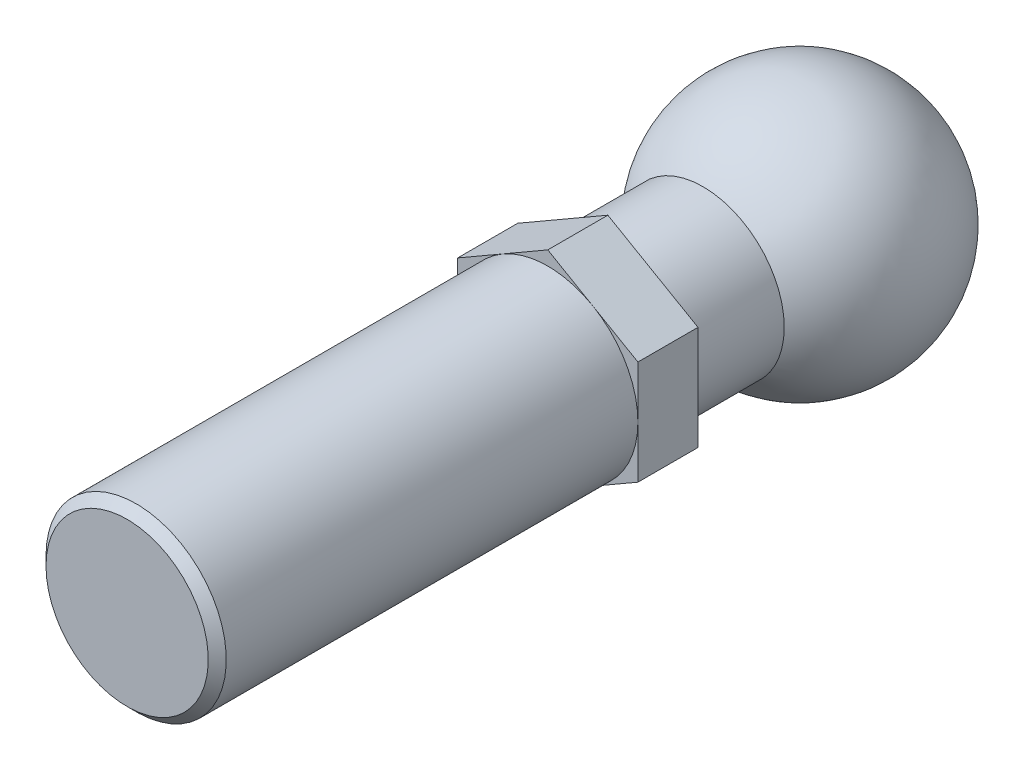
ISO-10303-21;
HEADER;
FILE_DESCRIPTION(('STEP AP214'),'2;1');
FILE_NAME('part.step','',(''),(''),'','','');
FILE_SCHEMA(('AUTOMOTIVE_DESIGN { 1 0 10303 214 1 1 1 1 }'));
ENDSEC;
DATA;
#1=APPLICATION_CONTEXT('core data for automotive mechanical design processes');
#2=APPLICATION_PROTOCOL_DEFINITION('international standard','automotive_design',2000,#1);
#3=PRODUCT_CONTEXT('',#1,'mechanical');
#4=PRODUCT('Part','Part','',(#3));
#5=PRODUCT_RELATED_PRODUCT_CATEGORY('part','',(#4));
#6=PRODUCT_DEFINITION_FORMATION('','',#4);
#7=PRODUCT_DEFINITION_CONTEXT('part definition',#1,'design');
#8=PRODUCT_DEFINITION('design','',#6,#7);
#9=PRODUCT_DEFINITION_SHAPE('','',#8);
#10=(LENGTH_UNIT() NAMED_UNIT(*) SI_UNIT(.MILLI.,.METRE.));
#11=(NAMED_UNIT(*) PLANE_ANGLE_UNIT() SI_UNIT($,.RADIAN.));
#12=(NAMED_UNIT(*) SI_UNIT($,.STERADIAN.) SOLID_ANGLE_UNIT());
#13=UNCERTAINTY_MEASURE_WITH_UNIT(LENGTH_MEASURE(1.E-05),#10,'distance_accuracy_value','');
#14=(GEOMETRIC_REPRESENTATION_CONTEXT(3) GLOBAL_UNCERTAINTY_ASSIGNED_CONTEXT((#13)) GLOBAL_UNIT_ASSIGNED_CONTEXT((#10,
#11,#12)) REPRESENTATION_CONTEXT('',''));
#15=CARTESIAN_POINT('',(0.,0.,0.));
#16=DIRECTION('',(0.,0.,1.));
#17=DIRECTION('',(1.,0.,0.));
#18=AXIS2_PLACEMENT_3D('',#15,#16,#17);
#19=CARTESIAN_POINT('',(0.,0.,0.));
#20=DIRECTION('',(0.,-1.,0.));
#21=DIRECTION('',(0.,0.,1.));
#22=AXIS2_PLACEMENT_3D('',#19,#20,#21);
#23=SPHERICAL_SURFACE('',#22,4.2);
#24=CARTESIAN_POINT('',(0.,4.2,0.));
#25=VERTEX_POINT('',#24);
#26=VERTEX_LOOP('',#25);
#27=FACE_BOUND('',#26,.T.);
#28=CARTESIAN_POINT('',(0.,0.,3.21714158842908));
#29=DIRECTION('',(0.,0.,-1.));
#30=DIRECTION('',(-1.,0.,0.));
#31=AXIS2_PLACEMENT_3D('',#28,#29,#30);
#32=CIRCLE('',#31,2.7);
#33=CARTESIAN_POINT('',(-2.7,0.,3.21714158842908));
#34=VERTEX_POINT('',#33);
#35=EDGE_CURVE('E20',#34,#34,#32,.F.);
#36=ORIENTED_EDGE('',*,*,#35,.F.);
#37=EDGE_LOOP('',(#36));
#38=FACE_BOUND('',#37,.T.);
#39=CARTESIAN_POINT('',(0.,-4.2,0.));
#40=VERTEX_POINT('',#39);
#41=VERTEX_LOOP('',#40);
#42=FACE_BOUND('',#41,.T.);
#43=ADVANCED_FACE('F16',(#27,#38,#42),#23,.T.);
#44=CARTESIAN_POINT('',(3.,-1.73205080756888,6.3875));
#45=DIRECTION('',(1.,0.,0.));
#46=DIRECTION('',(0.,1.,0.));
#47=AXIS2_PLACEMENT_3D('',#44,#45,#46);
#48=PLANE('',#47);
#49=DIRECTION('',(0.,0.,1.));
#50=VECTOR('',#49,1.);
#51=CARTESIAN_POINT('',(3.,1.73205080756888,6.3875));
#52=LINE('',#51,#50);
#53=CARTESIAN_POINT('',(3.,1.73205080756888,8.3875));
#54=VERTEX_POINT('',#53);
#55=CARTESIAN_POINT('',(3.,1.73205080756888,6.3875));
#56=VERTEX_POINT('',#55);
#57=EDGE_CURVE('E154',#54,#56,#52,.F.);
#58=ORIENTED_EDGE('',*,*,#57,.F.);
#59=DIRECTION('',(0.,1.,0.));
#60=VECTOR('',#59,1.);
#61=CARTESIAN_POINT('',(3.,-1.73205080756888,8.3875));
#62=LINE('',#61,#60);
#63=CARTESIAN_POINT('',(3.,0.,8.3875));
#64=VERTEX_POINT('',#63);
#65=EDGE_CURVE('E95',#54,#64,#62,.F.);
#66=ORIENTED_EDGE('',*,*,#65,.T.);
#67=DIRECTION('',(0.,1.,0.));
#68=VECTOR('',#67,1.);
#69=CARTESIAN_POINT('',(3.,-1.73205080756888,8.3875));
#70=LINE('',#69,#68);
#71=CARTESIAN_POINT('',(3.,-1.73205080756888,8.3875));
#72=VERTEX_POINT('',#71);
#73=EDGE_CURVE('E92',#64,#72,#70,.F.);
#74=ORIENTED_EDGE('',*,*,#73,.T.);
#75=DIRECTION('',(0.,0.,1.));
#76=VECTOR('',#75,1.);
#77=CARTESIAN_POINT('',(3.,-1.73205080756888,6.3875));
#78=LINE('',#77,#76);
#79=CARTESIAN_POINT('',(3.,-1.73205080756888,6.3875));
#80=VERTEX_POINT('',#79);
#81=EDGE_CURVE('E79',#80,#72,#78,.T.);
#82=ORIENTED_EDGE('',*,*,#81,.F.);
#83=DIRECTION('',(0.,1.,0.));
#84=VECTOR('',#83,1.);
#85=CARTESIAN_POINT('',(3.,1.73205080756888,6.3875));
#86=LINE('',#85,#84);
#87=EDGE_CURVE('E133',#56,#80,#86,.F.);
#88=ORIENTED_EDGE('',*,*,#87,.F.);
#89=EDGE_LOOP('',(#58,#66,#74,#82,#88));
#90=FACE_BOUND('',#89,.T.);
#91=ADVANCED_FACE('F69',(#90),#48,.T.);
#92=CARTESIAN_POINT('',(0.,-3.46410161513776,6.3875));
#93=DIRECTION('',(0.5,-0.866025403784439,0.));
#94=DIRECTION('',(0.866025403784439,0.5,0.));
#95=AXIS2_PLACEMENT_3D('',#92,#93,#94);
#96=PLANE('',#95);
#97=ORIENTED_EDGE('',*,*,#81,.T.);
#98=DIRECTION('',(0.866025403784439,0.5,0.));
#99=VECTOR('',#98,1.);
#100=CARTESIAN_POINT('',(0.,-3.46410161513776,8.3875));
#101=LINE('',#100,#99);
#102=CARTESIAN_POINT('',(1.5,-2.59807621135332,8.3875));
#103=VERTEX_POINT('',#102);
#104=EDGE_CURVE('E74',#72,#103,#101,.F.);
#105=ORIENTED_EDGE('',*,*,#104,.T.);
#106=DIRECTION('',(0.866025403784439,0.5,0.));
#107=VECTOR('',#106,1.);
#108=CARTESIAN_POINT('',(0.,-3.46410161513776,8.3875));
#109=LINE('',#108,#107);
#110=CARTESIAN_POINT('',(0.,-3.46410161513776,8.3875));
#111=VERTEX_POINT('',#110);
#112=EDGE_CURVE('E85',#103,#111,#109,.F.);
#113=ORIENTED_EDGE('',*,*,#112,.T.);
#114=DIRECTION('',(0.,0.,1.));
#115=VECTOR('',#114,1.);
#116=CARTESIAN_POINT('',(0.,-3.46410161513776,6.3875));
#117=LINE('',#116,#115);
#118=CARTESIAN_POINT('',(0.,-3.46410161513776,6.3875));
#119=VERTEX_POINT('',#118);
#120=EDGE_CURVE('E76',#119,#111,#117,.T.);
#121=ORIENTED_EDGE('',*,*,#120,.F.);
#122=DIRECTION('',(-0.866025403784439,-0.5,0.));
#123=VECTOR('',#122,1.);
#124=CARTESIAN_POINT('',(3.,-1.73205080756888,6.3875));
#125=LINE('',#124,#123);
#126=EDGE_CURVE('E126',#80,#119,#125,.T.);
#127=ORIENTED_EDGE('',*,*,#126,.F.);
#128=EDGE_LOOP('',(#97,#105,#113,#121,#127));
#129=FACE_BOUND('',#128,.T.);
#130=ADVANCED_FACE('F176',(#129),#96,.T.);
#131=CARTESIAN_POINT('',(0.,0.,8.3875));
#132=DIRECTION('',(0.,0.,-1.));
#133=DIRECTION('',(-1.,0.,0.));
#134=AXIS2_PLACEMENT_3D('',#131,#132,#133);
#135=CYLINDRICAL_SURFACE('',#134,2.7);
#136=CARTESIAN_POINT('',(0.,0.,6.3875));
#137=DIRECTION('',(0.,0.,-1.));
#138=DIRECTION('',(-1.,0.,0.));
#139=AXIS2_PLACEMENT_3D('',#136,#137,#138);
#140=CIRCLE('',#139,2.7);
#141=CARTESIAN_POINT('',(-2.7,0.,6.3875));
#142=VERTEX_POINT('',#141);
#143=EDGE_CURVE('E117',#142,#142,#140,.F.);
#144=ORIENTED_EDGE('',*,*,#143,.F.);
#145=EDGE_LOOP('',(#144));
#146=FACE_BOUND('',#145,.T.);
#147=ORIENTED_EDGE('',*,*,#35,.T.);
#148=EDGE_LOOP('',(#147));
#149=FACE_BOUND('',#148,.T.);
#150=ADVANCED_FACE('F396',(#146,#149),#135,.T.);
#151=CARTESIAN_POINT('',(-3.,-1.73205080756888,6.3875));
#152=DIRECTION('',(-0.5,-0.866025403784439,0.));
#153=DIRECTION('',(0.866025403784439,-0.5,0.));
#154=AXIS2_PLACEMENT_3D('',#151,#152,#153);
#155=PLANE('',#154);
#156=ORIENTED_EDGE('',*,*,#120,.T.);
#157=DIRECTION('',(0.866025403784439,-0.5,0.));
#158=VECTOR('',#157,1.);
#159=CARTESIAN_POINT('',(-3.,-1.73205080756888,8.3875));
#160=LINE('',#159,#158);
#161=CARTESIAN_POINT('',(-1.5,-2.59807621135332,8.3875));
#162=VERTEX_POINT('',#161);
#163=EDGE_CURVE('E142',#111,#162,#160,.F.);
#164=ORIENTED_EDGE('',*,*,#163,.T.);
#165=DIRECTION('',(0.866025403784439,-0.5,0.));
#166=VECTOR('',#165,1.);
#167=CARTESIAN_POINT('',(-3.,-1.73205080756888,8.3875));
#168=LINE('',#167,#166);
#169=CARTESIAN_POINT('',(-3.,-1.73205080756888,8.3875));
#170=VERTEX_POINT('',#169);
#171=EDGE_CURVE('E73',#162,#170,#168,.F.);
#172=ORIENTED_EDGE('',*,*,#171,.T.);
#173=DIRECTION('',(0.,0.,1.));
#174=VECTOR('',#173,1.);
#175=CARTESIAN_POINT('',(-3.,-1.73205080756888,6.3875));
#176=LINE('',#175,#174);
#177=CARTESIAN_POINT('',(-3.,-1.73205080756888,6.3875));
#178=VERTEX_POINT('',#177);
#179=EDGE_CURVE('E185',#178,#170,#176,.T.);
#180=ORIENTED_EDGE('',*,*,#179,.F.);
#181=DIRECTION('',(-0.866025403784439,0.5,0.));
#182=VECTOR('',#181,1.);
#183=CARTESIAN_POINT('',(0.,-3.46410161513775,6.3875));
#184=LINE('',#183,#182);
#185=EDGE_CURVE('E120',#119,#178,#184,.T.);
#186=ORIENTED_EDGE('',*,*,#185,.F.);
#187=EDGE_LOOP('',(#156,#164,#172,#180,#186));
#188=FACE_BOUND('',#187,.T.);
#189=ADVANCED_FACE('F183',(#188),#155,.T.);
#190=CARTESIAN_POINT('',(3.,1.73205080756888,6.3875));
#191=DIRECTION('',(0.5,0.866025403784439,0.));
#192=DIRECTION('',(-0.866025403784439,0.5,0.));
#193=AXIS2_PLACEMENT_3D('',#190,#191,#192);
#194=PLANE('',#193);
#195=DIRECTION('',(0.,0.,1.));
#196=VECTOR('',#195,1.);
#197=CARTESIAN_POINT('',(0.,3.46410161513775,6.3875));
#198=LINE('',#197,#196);
#199=CARTESIAN_POINT('',(0.,3.46410161513776,8.3875));
#200=VERTEX_POINT('',#199);
#201=CARTESIAN_POINT('',(0.,3.46410161513776,6.3875));
#202=VERTEX_POINT('',#201);
#203=EDGE_CURVE('E211',#200,#202,#198,.F.);
#204=ORIENTED_EDGE('',*,*,#203,.F.);
#205=DIRECTION('',(-0.866025403784439,0.5,0.));
#206=VECTOR('',#205,1.);
#207=CARTESIAN_POINT('',(3.,1.73205080756888,8.3875));
#208=LINE('',#207,#206);
#209=CARTESIAN_POINT('',(1.5,2.59807621135332,8.3875));
#210=VERTEX_POINT('',#209);
#211=EDGE_CURVE('E157',#200,#210,#208,.F.);
#212=ORIENTED_EDGE('',*,*,#211,.T.);
#213=DIRECTION('',(-0.866025403784439,0.5,0.));
#214=VECTOR('',#213,1.);
#215=CARTESIAN_POINT('',(3.,1.73205080756888,8.3875));
#216=LINE('',#215,#214);
#217=EDGE_CURVE('E158',#210,#54,#216,.F.);
#218=ORIENTED_EDGE('',*,*,#217,.T.);
#219=ORIENTED_EDGE('',*,*,#57,.T.);
#220=DIRECTION('',(0.866025403784439,-0.5,0.));
#221=VECTOR('',#220,1.);
#222=CARTESIAN_POINT('',(0.,3.46410161513775,6.3875));
#223=LINE('',#222,#221);
#224=EDGE_CURVE('E151',#202,#56,#223,.T.);
#225=ORIENTED_EDGE('',*,*,#224,.F.);
#226=EDGE_LOOP('',(#204,#212,#218,#219,#225));
#227=FACE_BOUND('',#226,.T.);
#228=ADVANCED_FACE('F208',(#227),#194,.T.);
#229=CARTESIAN_POINT('',(3.,1.73205080756888,6.3875));
#230=DIRECTION('',(0.,0.,-1.));
#231=DIRECTION('',(-1.,0.,0.));
#232=AXIS2_PLACEMENT_3D('',#229,#230,#231);
#233=PLANE('',#232);
#234=ORIENTED_EDGE('',*,*,#143,.T.);
#235=EDGE_LOOP('',(#234));
#236=FACE_BOUND('',#235,.T.);
#237=DIRECTION('',(0.,-1.,0.));
#238=VECTOR('',#237,1.);
#239=CARTESIAN_POINT('',(-3.,1.73205080756888,6.3875));
#240=LINE('',#239,#238);
#241=CARTESIAN_POINT('',(-3.,1.73205080756888,6.3875));
#242=VERTEX_POINT('',#241);
#243=EDGE_CURVE('E123',#242,#178,#240,.T.);
#244=ORIENTED_EDGE('',*,*,#243,.F.);
#245=DIRECTION('',(-0.866025403784439,-0.5,0.));
#246=VECTOR('',#245,1.);
#247=CARTESIAN_POINT('',(0.,3.46410161513775,6.3875));
#248=LINE('',#247,#246);
#249=EDGE_CURVE('E236',#202,#242,#248,.T.);
#250=ORIENTED_EDGE('',*,*,#249,.F.);
#251=ORIENTED_EDGE('',*,*,#224,.T.);
#252=ORIENTED_EDGE('',*,*,#87,.T.);
#253=ORIENTED_EDGE('',*,*,#126,.T.);
#254=ORIENTED_EDGE('',*,*,#185,.T.);
#255=EDGE_LOOP('',(#244,#250,#251,#252,#253,#254));
#256=FACE_BOUND('',#255,.T.);
#257=ADVANCED_FACE('F189',(#236,#256),#233,.T.);
#258=CARTESIAN_POINT('',(-3.,1.73205080756888,6.3875));
#259=DIRECTION('',(-1.,0.,0.));
#260=DIRECTION('',(0.,-1.,0.));
#261=AXIS2_PLACEMENT_3D('',#258,#259,#260);
#262=PLANE('',#261);
#263=ORIENTED_EDGE('',*,*,#179,.T.);
#264=DIRECTION('',(0.,-1.,0.));
#265=VECTOR('',#264,1.);
#266=CARTESIAN_POINT('',(-3.,1.73205080756888,8.3875));
#267=LINE('',#266,#265);
#268=CARTESIAN_POINT('',(-3.,0.,8.3875));
#269=VERTEX_POINT('',#268);
#270=EDGE_CURVE('E221',#170,#269,#267,.F.);
#271=ORIENTED_EDGE('',*,*,#270,.T.);
#272=DIRECTION('',(0.,-1.,0.));
#273=VECTOR('',#272,1.);
#274=CARTESIAN_POINT('',(-3.,1.73205080756888,8.3875));
#275=LINE('',#274,#273);
#276=CARTESIAN_POINT('',(-3.,1.73205080756888,8.3875));
#277=VERTEX_POINT('',#276);
#278=EDGE_CURVE('E119',#269,#277,#275,.F.);
#279=ORIENTED_EDGE('',*,*,#278,.T.);
#280=DIRECTION('',(0.,0.,1.));
#281=VECTOR('',#280,1.);
#282=CARTESIAN_POINT('',(-3.,1.73205080756888,6.3875));
#283=LINE('',#282,#281);
#284=EDGE_CURVE('E116',#242,#277,#283,.T.);
#285=ORIENTED_EDGE('',*,*,#284,.F.);
#286=ORIENTED_EDGE('',*,*,#243,.T.);
#287=EDGE_LOOP('',(#263,#271,#279,#285,#286));
#288=FACE_BOUND('',#287,.T.);
#289=ADVANCED_FACE('F273',(#288),#262,.T.);
#290=CARTESIAN_POINT('',(0.,2.69999999999999,22.3875));
#291=DIRECTION('',(0.,0.,1.));
#292=DIRECTION('',(1.,0.,0.));
#293=AXIS2_PLACEMENT_3D('',#290,#291,#292);
#294=PLANE('',#293);
#295=CARTESIAN_POINT('',(0.,0.,22.3875000000362));
#296=DIRECTION('',(0.,0.,-1.));
#297=DIRECTION('',(-1.,0.,0.));
#298=AXIS2_PLACEMENT_3D('',#295,#296,#297);
#299=CIRCLE('',#298,2.70000000000437);
#300=CARTESIAN_POINT('',(-2.70000000000437,0.,22.3875000000362));
#301=VERTEX_POINT('',#300);
#302=EDGE_CURVE('E113',#301,#301,#299,.T.);
#303=ORIENTED_EDGE('',*,*,#302,.F.);
#304=EDGE_LOOP('',(#303));
#305=FACE_BOUND('',#304,.T.);
#306=ADVANCED_FACE('F275',(#305),#294,.T.);
#307=CARTESIAN_POINT('',(0.,3.46410161513775,6.3875));
#308=DIRECTION('',(-0.5,0.866025403784439,0.));
#309=DIRECTION('',(-0.866025403784439,-0.5,0.));
#310=AXIS2_PLACEMENT_3D('',#307,#308,#309);
#311=PLANE('',#310);
#312=ORIENTED_EDGE('',*,*,#284,.T.);
#313=DIRECTION('',(-0.866025403784439,-0.499999999999999,0.));
#314=VECTOR('',#313,1.);
#315=CARTESIAN_POINT('',(-1.5,2.59807621135332,8.3875));
#316=LINE('',#315,#314);
#317=CARTESIAN_POINT('',(-1.5,2.59807621135332,8.3875));
#318=VERTEX_POINT('',#317);
#319=EDGE_CURVE('E35',#318,#277,#316,.T.);
#320=ORIENTED_EDGE('',*,*,#319,.F.);
#321=DIRECTION('',(-0.866025403784438,-0.500000000000001,0.));
#322=VECTOR('',#321,1.);
#323=CARTESIAN_POINT('',(0.,3.46410161513775,8.3875));
#324=LINE('',#323,#322);
#325=EDGE_CURVE('E115',#200,#318,#324,.T.);
#326=ORIENTED_EDGE('',*,*,#325,.F.);
#327=ORIENTED_EDGE('',*,*,#203,.T.);
#328=ORIENTED_EDGE('',*,*,#249,.T.);
#329=EDGE_LOOP('',(#312,#320,#326,#327,#328));
#330=FACE_BOUND('',#329,.T.);
#331=ADVANCED_FACE('F265',(#330),#311,.T.);
#332=CARTESIAN_POINT('',(0.,0.,8.3875));
#333=DIRECTION('',(0.,0.,1.));
#334=DIRECTION('',(1.,0.,0.));
#335=AXIS2_PLACEMENT_3D('',#332,#333,#334);
#336=PLANE('',#335);
#337=CARTESIAN_POINT('',(0.,0.,8.3875));
#338=DIRECTION('',(0.,0.,-1.));
#339=DIRECTION('',(-1.,0.,0.));
#340=AXIS2_PLACEMENT_3D('',#337,#338,#339);
#341=CIRCLE('',#340,3.);
#342=EDGE_CURVE('E110',#269,#162,#341,.F.);
#343=ORIENTED_EDGE('',*,*,#342,.F.);
#344=ORIENTED_EDGE('',*,*,#270,.F.);
#345=ORIENTED_EDGE('',*,*,#171,.F.);
#346=EDGE_LOOP('',(#343,#344,#345));
#347=FACE_BOUND('',#346,.T.);
#348=ADVANCED_FACE('F272',(#347),#336,.T.);
#349=CARTESIAN_POINT('',(0.,0.,8.3875));
#350=DIRECTION('',(0.,0.,1.));
#351=DIRECTION('',(1.,0.,0.));
#352=AXIS2_PLACEMENT_3D('',#349,#350,#351);
#353=PLANE('',#352);
#354=CARTESIAN_POINT('',(0.,0.,8.3875));
#355=DIRECTION('',(0.,0.,-1.));
#356=DIRECTION('',(-1.,0.,0.));
#357=AXIS2_PLACEMENT_3D('',#354,#355,#356);
#358=CIRCLE('',#357,3.);
#359=EDGE_CURVE('E107',#162,#103,#358,.F.);
#360=ORIENTED_EDGE('',*,*,#359,.F.);
#361=ORIENTED_EDGE('',*,*,#163,.F.);
#362=ORIENTED_EDGE('',*,*,#112,.F.);
#363=EDGE_LOOP('',(#360,#361,#362));
#364=FACE_BOUND('',#363,.T.);
#365=ADVANCED_FACE('F181',(#364),#353,.T.);
#366=CARTESIAN_POINT('',(0.,0.,8.3875));
#367=DIRECTION('',(0.,0.,1.));
#368=DIRECTION('',(1.,0.,0.));
#369=AXIS2_PLACEMENT_3D('',#366,#367,#368);
#370=PLANE('',#369);
#371=CARTESIAN_POINT('',(0.,0.,8.3875));
#372=DIRECTION('',(0.,0.,-1.));
#373=DIRECTION('',(-1.,0.,0.));
#374=AXIS2_PLACEMENT_3D('',#371,#372,#373);
#375=CIRCLE('',#374,3.);
#376=EDGE_CURVE('E104',#103,#64,#375,.F.);
#377=ORIENTED_EDGE('',*,*,#376,.F.);
#378=ORIENTED_EDGE('',*,*,#104,.F.);
#379=ORIENTED_EDGE('',*,*,#73,.F.);
#380=EDGE_LOOP('',(#377,#378,#379));
#381=FACE_BOUND('',#380,.T.);
#382=ADVANCED_FACE('F299',(#381),#370,.T.);
#383=CARTESIAN_POINT('',(0.,0.,22.0875000000547));
#384=DIRECTION('',(0.,0.,-1.));
#385=DIRECTION('',(-1.,0.,0.));
#386=AXIS2_PLACEMENT_3D('',#383,#384,#385);
#387=CONICAL_SURFACE('',#386,2.9999999999859,0.785398163397448);
#388=CARTESIAN_POINT('',(0.,0.,22.0875));
#389=DIRECTION('',(0.,0.,-1.));
#390=DIRECTION('',(-1.,0.,0.));
#391=AXIS2_PLACEMENT_3D('',#388,#389,#390);
#392=CIRCLE('',#391,3.);
#393=CARTESIAN_POINT('',(-3.,0.,22.0875));
#394=VERTEX_POINT('',#393);
#395=EDGE_CURVE('E103',#394,#394,#392,.T.);
#396=ORIENTED_EDGE('',*,*,#395,.F.);
#397=EDGE_LOOP('',(#396));
#398=FACE_BOUND('',#397,.T.);
#399=ORIENTED_EDGE('',*,*,#302,.T.);
#400=EDGE_LOOP('',(#399));
#401=FACE_BOUND('',#400,.T.);
#402=ADVANCED_FACE('F296',(#398,#401),#387,.T.);
#403=CARTESIAN_POINT('',(0.,0.,8.3875));
#404=DIRECTION('',(0.,0.,1.));
#405=DIRECTION('',(1.,0.,0.));
#406=AXIS2_PLACEMENT_3D('',#403,#404,#405);
#407=PLANE('',#406);
#408=CARTESIAN_POINT('',(0.,0.,8.3875));
#409=DIRECTION('',(0.,0.,-1.));
#410=DIRECTION('',(-1.,0.,0.));
#411=AXIS2_PLACEMENT_3D('',#408,#409,#410);
#412=CIRCLE('',#411,3.);
#413=EDGE_CURVE('E100',#64,#210,#412,.F.);
#414=ORIENTED_EDGE('',*,*,#413,.F.);
#415=ORIENTED_EDGE('',*,*,#65,.F.);
#416=ORIENTED_EDGE('',*,*,#217,.F.);
#417=EDGE_LOOP('',(#414,#415,#416));
#418=FACE_BOUND('',#417,.T.);
#419=ADVANCED_FACE('F203',(#418),#407,.T.);
#420=CARTESIAN_POINT('',(0.,0.,8.3875));
#421=DIRECTION('',(0.,0.,1.));
#422=DIRECTION('',(1.,0.,0.));
#423=AXIS2_PLACEMENT_3D('',#420,#421,#422);
#424=PLANE('',#423);
#425=CARTESIAN_POINT('',(0.,0.,8.3875));
#426=DIRECTION('',(0.,0.,-1.));
#427=DIRECTION('',(-1.,0.,0.));
#428=AXIS2_PLACEMENT_3D('',#425,#426,#427);
#429=CIRCLE('',#428,3.);
#430=EDGE_CURVE('E26',#210,#318,#429,.F.);
#431=ORIENTED_EDGE('',*,*,#430,.F.);
#432=ORIENTED_EDGE('',*,*,#211,.F.);
#433=ORIENTED_EDGE('',*,*,#325,.T.);
#434=EDGE_LOOP('',(#431,#432,#433));
#435=FACE_BOUND('',#434,.T.);
#436=ADVANCED_FACE('F264',(#435),#424,.T.);
#437=CARTESIAN_POINT('',(0.,0.,8.3875));
#438=DIRECTION('',(0.,0.,1.));
#439=DIRECTION('',(1.,0.,0.));
#440=AXIS2_PLACEMENT_3D('',#437,#438,#439);
#441=PLANE('',#440);
#442=CARTESIAN_POINT('',(0.,0.,8.3875));
#443=DIRECTION('',(0.,0.,-1.));
#444=DIRECTION('',(-1.,0.,0.));
#445=AXIS2_PLACEMENT_3D('',#442,#443,#444);
#446=CIRCLE('',#445,3.);
#447=EDGE_CURVE('E11',#318,#269,#446,.F.);
#448=ORIENTED_EDGE('',*,*,#447,.F.);
#449=ORIENTED_EDGE('',*,*,#319,.T.);
#450=ORIENTED_EDGE('',*,*,#278,.F.);
#451=EDGE_LOOP('',(#448,#449,#450));
#452=FACE_BOUND('',#451,.T.);
#453=ADVANCED_FACE('F259',(#452),#441,.T.);
#454=CARTESIAN_POINT('',(0.,0.,0.));
#455=DIRECTION('',(0.,0.,-1.));
#456=DIRECTION('',(-1.,0.,0.));
#457=AXIS2_PLACEMENT_3D('',#454,#455,#456);
#458=CYLINDRICAL_SURFACE('',#457,3.);
#459=ORIENTED_EDGE('',*,*,#376,.T.);
#460=ORIENTED_EDGE('',*,*,#413,.T.);
#461=ORIENTED_EDGE('',*,*,#430,.T.);
#462=ORIENTED_EDGE('',*,*,#447,.T.);
#463=ORIENTED_EDGE('',*,*,#342,.T.);
#464=ORIENTED_EDGE('',*,*,#359,.T.);
#465=EDGE_LOOP('',(#459,#460,#461,#462,#463,#464));
#466=FACE_BOUND('',#465,.T.);
#467=ORIENTED_EDGE('',*,*,#395,.T.);
#468=EDGE_LOOP('',(#467));
#469=FACE_BOUND('',#468,.T.);
#470=ADVANCED_FACE('F262',(#466,#469),#458,.T.);
#471=CLOSED_SHELL('',(#43,#91,#130,#150,#189,#228,#257,#289,#306,#331,#348,#365,#382,#402,#419,
#436,#453,#470));
#472=MANIFOLD_SOLID_BREP('B1',#471);
#473=ADVANCED_BREP_SHAPE_REPRESENTATION('',(#18,#472),#14);
#474=SHAPE_DEFINITION_REPRESENTATION(#9,#473);
ENDSEC;
END-ISO-10303-21;
